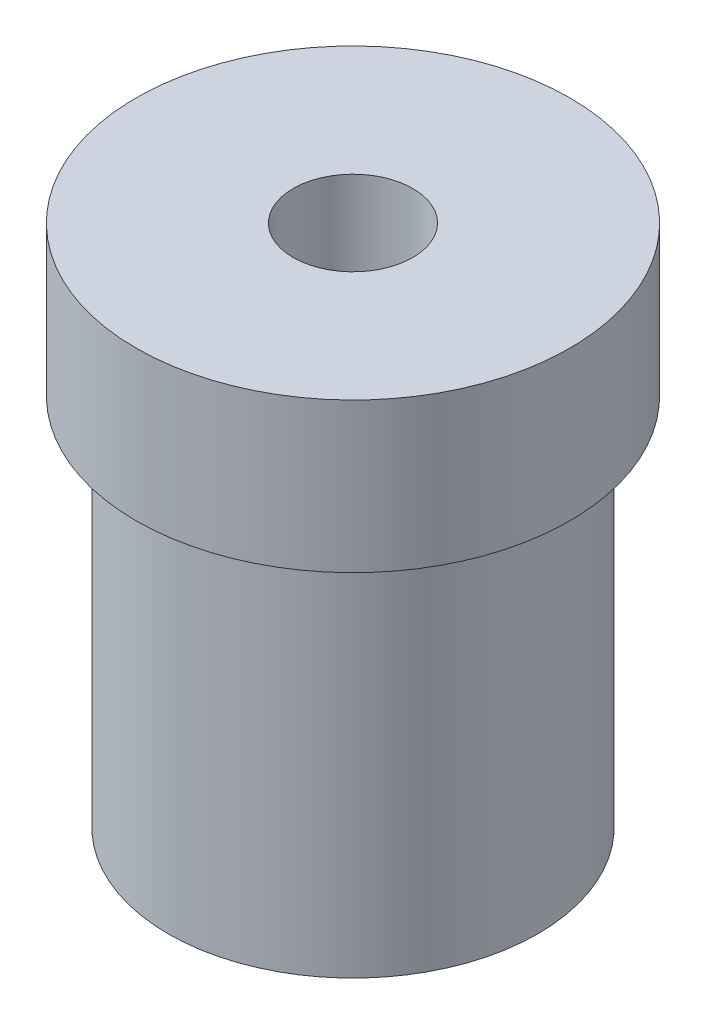
ISO-10303-21;
HEADER;
FILE_DESCRIPTION(('STEP AP214'),'2;1');
FILE_NAME('part.step','',(''),(''),'','','');
FILE_SCHEMA(('AUTOMOTIVE_DESIGN { 1 0 10303 214 1 1 1 1 }'));
ENDSEC;
DATA;
#1=APPLICATION_CONTEXT('core data for automotive mechanical design processes');
#2=APPLICATION_PROTOCOL_DEFINITION('international standard','automotive_design',2000,#1);
#3=PRODUCT_CONTEXT('',#1,'mechanical');
#4=PRODUCT('Part','Part','',(#3));
#5=PRODUCT_RELATED_PRODUCT_CATEGORY('part','',(#4));
#6=PRODUCT_DEFINITION_FORMATION('','',#4);
#7=PRODUCT_DEFINITION_CONTEXT('part definition',#1,'design');
#8=PRODUCT_DEFINITION('design','',#6,#7);
#9=PRODUCT_DEFINITION_SHAPE('','',#8);
#10=(LENGTH_UNIT() NAMED_UNIT(*) SI_UNIT(.MILLI.,.METRE.));
#11=(NAMED_UNIT(*) PLANE_ANGLE_UNIT() SI_UNIT($,.RADIAN.));
#12=(NAMED_UNIT(*) SI_UNIT($,.STERADIAN.) SOLID_ANGLE_UNIT());
#13=UNCERTAINTY_MEASURE_WITH_UNIT(LENGTH_MEASURE(1.E-05),#10,'distance_accuracy_value','');
#14=(GEOMETRIC_REPRESENTATION_CONTEXT(3) GLOBAL_UNCERTAINTY_ASSIGNED_CONTEXT((#13)) GLOBAL_UNIT_ASSIGNED_CONTEXT((#10,
#11,#12)) REPRESENTATION_CONTEXT('',''));
#15=CARTESIAN_POINT('',(0.,0.,0.));
#16=DIRECTION('',(0.,0.,1.));
#17=DIRECTION('',(1.,0.,0.));
#18=AXIS2_PLACEMENT_3D('',#15,#16,#17);
#19=CARTESIAN_POINT('',(0.,25.,0.));
#20=DIRECTION('',(0.,-1.,0.));
#21=DIRECTION('',(0.,0.,-1.));
#22=AXIS2_PLACEMENT_3D('',#19,#20,#21);
#23=CYLINDRICAL_SURFACE('',#22,12.35);
#24=CARTESIAN_POINT('',(0.,25.,0.));
#25=DIRECTION('',(0.,1.,0.));
#26=DIRECTION('',(0.,0.,1.));
#27=AXIS2_PLACEMENT_3D('',#24,#25,#26);
#28=CIRCLE('',#27,12.35);
#29=CARTESIAN_POINT('',(0.,25.,12.35));
#30=VERTEX_POINT('',#29);
#31=EDGE_CURVE('E10',#30,#30,#28,.T.);
#32=ORIENTED_EDGE('',*,*,#31,.F.);
#33=EDGE_LOOP('',(#32));
#34=FACE_BOUND('',#33,.T.);
#35=CARTESIAN_POINT('',(0.,0.,0.));
#36=DIRECTION('',(0.,1.,0.));
#37=DIRECTION('',(0.,0.,1.));
#38=AXIS2_PLACEMENT_3D('',#35,#36,#37);
#39=CIRCLE('',#38,12.35);
#40=CARTESIAN_POINT('',(0.,0.,12.35));
#41=VERTEX_POINT('',#40);
#42=EDGE_CURVE('E40',#41,#41,#39,.T.);
#43=ORIENTED_EDGE('',*,*,#42,.T.);
#44=EDGE_LOOP('',(#43));
#45=FACE_BOUND('',#44,.T.);
#46=ADVANCED_FACE('F33',(#34,#45),#23,.T.);
#47=CARTESIAN_POINT('',(0.,0.,0.));
#48=DIRECTION('',(0.,1.,0.));
#49=DIRECTION('',(0.,0.,1.));
#50=AXIS2_PLACEMENT_3D('',#47,#48,#49);
#51=PLANE('',#50);
#52=CARTESIAN_POINT('',(0.,0.,0.));
#53=DIRECTION('',(0.,1.,0.));
#54=DIRECTION('',(0.,0.,1.));
#55=AXIS2_PLACEMENT_3D('',#52,#53,#54);
#56=CIRCLE('',#55,4.);
#57=CARTESIAN_POINT('',(0.,0.,4.));
#58=VERTEX_POINT('',#57);
#59=EDGE_CURVE('E52',#58,#58,#56,.T.);
#60=ORIENTED_EDGE('',*,*,#59,.T.);
#61=EDGE_LOOP('',(#60));
#62=FACE_BOUND('',#61,.T.);
#63=ORIENTED_EDGE('',*,*,#42,.F.);
#64=EDGE_LOOP('',(#63));
#65=FACE_BOUND('',#64,.T.);
#66=ADVANCED_FACE('F72',(#62,#65),#51,.F.);
#67=CARTESIAN_POINT('',(0.,35.,0.));
#68=DIRECTION('',(0.,-1.,0.));
#69=DIRECTION('',(0.,0.,-1.));
#70=AXIS2_PLACEMENT_3D('',#67,#68,#69);
#71=CYLINDRICAL_SURFACE('',#70,14.5);
#72=CARTESIAN_POINT('',(0.,35.,0.));
#73=DIRECTION('',(0.,1.,0.));
#74=DIRECTION('',(0.,0.,1.));
#75=AXIS2_PLACEMENT_3D('',#72,#73,#74);
#76=CIRCLE('',#75,14.5);
#77=CARTESIAN_POINT('',(0.,35.,14.5));
#78=VERTEX_POINT('',#77);
#79=EDGE_CURVE('E45',#78,#78,#76,.T.);
#80=ORIENTED_EDGE('',*,*,#79,.F.);
#81=EDGE_LOOP('',(#80));
#82=FACE_BOUND('',#81,.T.);
#83=CARTESIAN_POINT('',(0.,25.,0.));
#84=DIRECTION('',(0.,1.,0.));
#85=DIRECTION('',(0.,0.,1.));
#86=AXIS2_PLACEMENT_3D('',#83,#84,#85);
#87=CIRCLE('',#86,14.5);
#88=CARTESIAN_POINT('',(0.,25.,14.5));
#89=VERTEX_POINT('',#88);
#90=EDGE_CURVE('E47',#89,#89,#87,.T.);
#91=ORIENTED_EDGE('',*,*,#90,.T.);
#92=EDGE_LOOP('',(#91));
#93=FACE_BOUND('',#92,.T.);
#94=ADVANCED_FACE('F66',(#82,#93),#71,.T.);
#95=CARTESIAN_POINT('',(0.,35.,0.));
#96=DIRECTION('',(0.,1.,0.));
#97=DIRECTION('',(0.,0.,1.));
#98=AXIS2_PLACEMENT_3D('',#95,#96,#97);
#99=PLANE('',#98);
#100=CARTESIAN_POINT('',(0.,35.,0.));
#101=DIRECTION('',(0.,1.,0.));
#102=DIRECTION('',(0.,0.,1.));
#103=AXIS2_PLACEMENT_3D('',#100,#101,#102);
#104=CIRCLE('',#103,4.);
#105=CARTESIAN_POINT('',(0.,35.,4.));
#106=VERTEX_POINT('',#105);
#107=EDGE_CURVE('E36',#106,#106,#104,.T.);
#108=ORIENTED_EDGE('',*,*,#107,.F.);
#109=EDGE_LOOP('',(#108));
#110=FACE_BOUND('',#109,.T.);
#111=ORIENTED_EDGE('',*,*,#79,.T.);
#112=EDGE_LOOP('',(#111));
#113=FACE_BOUND('',#112,.T.);
#114=ADVANCED_FACE('F62',(#110,#113),#99,.T.);
#115=CARTESIAN_POINT('',(0.,25.,0.));
#116=DIRECTION('',(0.,1.,0.));
#117=DIRECTION('',(0.,0.,1.));
#118=AXIS2_PLACEMENT_3D('',#115,#116,#117);
#119=PLANE('',#118);
#120=ORIENTED_EDGE('',*,*,#31,.T.);
#121=EDGE_LOOP('',(#120));
#122=FACE_BOUND('',#121,.T.);
#123=ORIENTED_EDGE('',*,*,#90,.F.);
#124=EDGE_LOOP('',(#123));
#125=FACE_BOUND('',#124,.T.);
#126=ADVANCED_FACE('F65',(#122,#125),#119,.F.);
#127=CARTESIAN_POINT('',(0.,0.,0.));
#128=DIRECTION('',(0.,1.,0.));
#129=DIRECTION('',(0.,0.,1.));
#130=AXIS2_PLACEMENT_3D('',#127,#128,#129);
#131=CYLINDRICAL_SURFACE('',#130,4.);
#132=ORIENTED_EDGE('',*,*,#107,.T.);
#133=EDGE_LOOP('',(#132));
#134=FACE_BOUND('',#133,.T.);
#135=ORIENTED_EDGE('',*,*,#59,.F.);
#136=EDGE_LOOP('',(#135));
#137=FACE_BOUND('',#136,.T.);
#138=ADVANCED_FACE('F59',(#134,#137),#131,.F.);
#139=CLOSED_SHELL('',(#46,#66,#94,#114,#126,#138));
#140=MANIFOLD_SOLID_BREP('B2',#139);
#141=ADVANCED_BREP_SHAPE_REPRESENTATION('',(#18,#140),#14);
#142=SHAPE_DEFINITION_REPRESENTATION(#9,#141);
ENDSEC;
END-ISO-10303-21;
